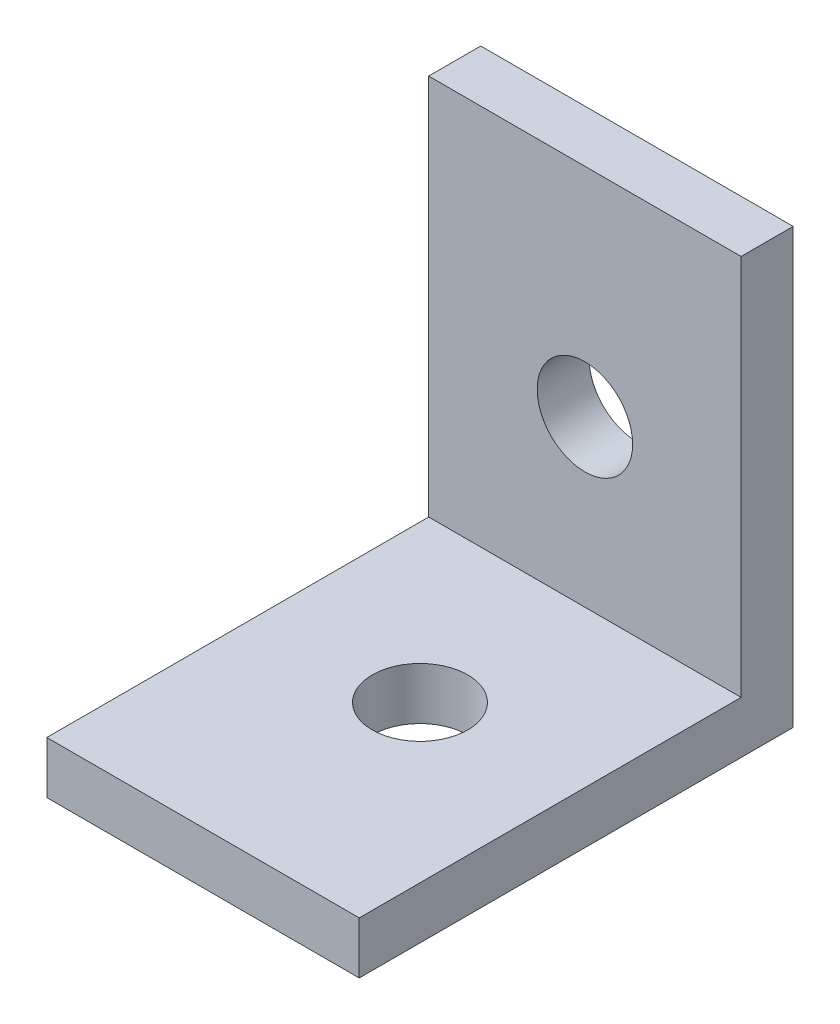
ISO-10303-21;
HEADER;
FILE_DESCRIPTION(('STEP AP214'),'2;1');
FILE_NAME('part.step','',(''),(''),'','','');
FILE_SCHEMA(('AUTOMOTIVE_DESIGN { 1 0 10303 214 1 1 1 1 }'));
ENDSEC;
DATA;
#1=APPLICATION_CONTEXT('core data for automotive mechanical design processes');
#2=APPLICATION_PROTOCOL_DEFINITION('international standard','automotive_design',2000,#1);
#3=PRODUCT_CONTEXT('',#1,'mechanical');
#4=PRODUCT('Part','Part','',(#3));
#5=PRODUCT_RELATED_PRODUCT_CATEGORY('part','',(#4));
#6=PRODUCT_DEFINITION_FORMATION('','',#4);
#7=PRODUCT_DEFINITION_CONTEXT('part definition',#1,'design');
#8=PRODUCT_DEFINITION('design','',#6,#7);
#9=PRODUCT_DEFINITION_SHAPE('','',#8);
#10=(LENGTH_UNIT() NAMED_UNIT(*) SI_UNIT(.MILLI.,.METRE.));
#11=(NAMED_UNIT(*) PLANE_ANGLE_UNIT() SI_UNIT($,.RADIAN.));
#12=(NAMED_UNIT(*) SI_UNIT($,.STERADIAN.) SOLID_ANGLE_UNIT());
#13=UNCERTAINTY_MEASURE_WITH_UNIT(LENGTH_MEASURE(1.E-05),#10,'distance_accuracy_value','');
#14=(GEOMETRIC_REPRESENTATION_CONTEXT(3) GLOBAL_UNCERTAINTY_ASSIGNED_CONTEXT((#13)) GLOBAL_UNIT_ASSIGNED_CONTEXT((#10,
#11,#12)) REPRESENTATION_CONTEXT('',''));
#15=CARTESIAN_POINT('',(0.,0.,0.));
#16=DIRECTION('',(0.,0.,1.));
#17=DIRECTION('',(1.,0.,0.));
#18=AXIS2_PLACEMENT_3D('',#15,#16,#17);
#19=CARTESIAN_POINT('',(0.,3.,0.));
#20=DIRECTION('',(0.,1.,0.));
#21=DIRECTION('',(0.,0.,1.));
#22=AXIS2_PLACEMENT_3D('',#19,#20,#21);
#23=PLANE('',#22);
#24=DIRECTION('',(1.,0.,0.));
#25=VECTOR('',#24,1.);
#26=CARTESIAN_POINT('',(-9.,3.,-9.5));
#27=LINE('',#26,#25);
#28=CARTESIAN_POINT('',(-9.,3.,-9.5));
#29=VERTEX_POINT('',#28);
#30=CARTESIAN_POINT('',(9.,3.,-9.5));
#31=VERTEX_POINT('',#30);
#32=EDGE_CURVE('E53',#29,#31,#27,.T.);
#33=ORIENTED_EDGE('',*,*,#32,.F.);
#34=DIRECTION('',(0.,0.,1.));
#35=VECTOR('',#34,1.);
#36=CARTESIAN_POINT('',(-9.,3.,-12.5));
#37=LINE('',#36,#35);
#38=CARTESIAN_POINT('',(-9.,3.,12.5));
#39=VERTEX_POINT('',#38);
#40=EDGE_CURVE('E150',#29,#39,#37,.T.);
#41=ORIENTED_EDGE('',*,*,#40,.T.);
#42=DIRECTION('',(1.,0.,0.));
#43=VECTOR('',#42,1.);
#44=CARTESIAN_POINT('',(-9.,3.,12.5));
#45=LINE('',#44,#43);
#46=CARTESIAN_POINT('',(9.,3.,12.5));
#47=VERTEX_POINT('',#46);
#48=EDGE_CURVE('E58',#39,#47,#45,.T.);
#49=ORIENTED_EDGE('',*,*,#48,.T.);
#50=DIRECTION('',(0.,0.,-1.));
#51=VECTOR('',#50,1.);
#52=CARTESIAN_POINT('',(9.,3.,-12.5));
#53=LINE('',#52,#51);
#54=EDGE_CURVE('E90',#47,#31,#53,.T.);
#55=ORIENTED_EDGE('',*,*,#54,.T.);
#56=EDGE_LOOP('',(#33,#41,#49,#55));
#57=FACE_BOUND('',#56,.T.);
#58=CARTESIAN_POINT('',(0.,3.,0.));
#59=DIRECTION('',(0.,1.,0.));
#60=DIRECTION('',(0.,0.,1.));
#61=AXIS2_PLACEMENT_3D('',#58,#59,#60);
#62=CIRCLE('',#61,2.75);
#63=CARTESIAN_POINT('',(0.,3.,2.75));
#64=VERTEX_POINT('',#63);
#65=EDGE_CURVE('E101',#64,#64,#62,.T.);
#66=ORIENTED_EDGE('',*,*,#65,.F.);
#67=EDGE_LOOP('',(#66));
#68=FACE_BOUND('',#67,.T.);
#69=ADVANCED_FACE('F39',(#57,#68),#23,.T.);
#70=CARTESIAN_POINT('',(0.,0.,0.));
#71=DIRECTION('',(0.,1.,0.));
#72=DIRECTION('',(0.,0.,1.));
#73=AXIS2_PLACEMENT_3D('',#70,#71,#72);
#74=PLANE('',#73);
#75=DIRECTION('',(0.,0.,-1.));
#76=VECTOR('',#75,1.);
#77=CARTESIAN_POINT('',(9.,0.,-12.5));
#78=LINE('',#77,#76);
#79=CARTESIAN_POINT('',(9.,0.,12.5));
#80=VERTEX_POINT('',#79);
#81=CARTESIAN_POINT('',(9.,0.,-12.5));
#82=VERTEX_POINT('',#81);
#83=EDGE_CURVE('E92',#80,#82,#78,.T.);
#84=ORIENTED_EDGE('',*,*,#83,.F.);
#85=DIRECTION('',(1.,0.,0.));
#86=VECTOR('',#85,1.);
#87=CARTESIAN_POINT('',(-9.,0.,12.5));
#88=LINE('',#87,#86);
#89=CARTESIAN_POINT('',(-9.,0.,12.5));
#90=VERTEX_POINT('',#89);
#91=EDGE_CURVE('E80',#90,#80,#88,.T.);
#92=ORIENTED_EDGE('',*,*,#91,.F.);
#93=DIRECTION('',(0.,0.,1.));
#94=VECTOR('',#93,1.);
#95=CARTESIAN_POINT('',(-9.,0.,-12.5));
#96=LINE('',#95,#94);
#97=CARTESIAN_POINT('',(-9.,0.,-12.5));
#98=VERTEX_POINT('',#97);
#99=EDGE_CURVE('E89',#98,#90,#96,.T.);
#100=ORIENTED_EDGE('',*,*,#99,.F.);
#101=DIRECTION('',(-1.,0.,0.));
#102=VECTOR('',#101,1.);
#103=CARTESIAN_POINT('',(-9.,0.,-12.5));
#104=LINE('',#103,#102);
#105=EDGE_CURVE('E99',#82,#98,#104,.T.);
#106=ORIENTED_EDGE('',*,*,#105,.F.);
#107=EDGE_LOOP('',(#84,#92,#100,#106));
#108=FACE_BOUND('',#107,.T.);
#109=CARTESIAN_POINT('',(0.,0.,0.));
#110=DIRECTION('',(0.,1.,0.));
#111=DIRECTION('',(0.,0.,1.));
#112=AXIS2_PLACEMENT_3D('',#109,#110,#111);
#113=CIRCLE('',#112,2.75);
#114=CARTESIAN_POINT('',(0.,0.,2.75));
#115=VERTEX_POINT('',#114);
#116=EDGE_CURVE('E104',#115,#115,#113,.T.);
#117=ORIENTED_EDGE('',*,*,#116,.T.);
#118=EDGE_LOOP('',(#117));
#119=FACE_BOUND('',#118,.T.);
#120=ADVANCED_FACE('F98',(#108,#119),#74,.F.);
#121=CARTESIAN_POINT('',(9.,3.,-12.5));
#122=DIRECTION('',(-1.,0.,0.));
#123=DIRECTION('',(0.,0.,1.));
#124=AXIS2_PLACEMENT_3D('',#121,#122,#123);
#125=PLANE('',#124);
#126=ORIENTED_EDGE('',*,*,#83,.T.);
#127=DIRECTION('',(0.,-1.,0.));
#128=VECTOR('',#127,1.);
#129=CARTESIAN_POINT('',(9.,3.,-12.5));
#130=LINE('',#129,#128);
#131=CARTESIAN_POINT('',(9.,25.,-12.5));
#132=VERTEX_POINT('',#131);
#133=EDGE_CURVE('E11',#132,#82,#130,.T.);
#134=ORIENTED_EDGE('',*,*,#133,.F.);
#135=DIRECTION('',(0.,0.,-1.));
#136=VECTOR('',#135,1.);
#137=CARTESIAN_POINT('',(9.,25.,-12.5));
#138=LINE('',#137,#136);
#139=CARTESIAN_POINT('',(9.,25.,-9.5));
#140=VERTEX_POINT('',#139);
#141=EDGE_CURVE('E134',#140,#132,#138,.T.);
#142=ORIENTED_EDGE('',*,*,#141,.F.);
#143=DIRECTION('',(0.,-1.,0.));
#144=VECTOR('',#143,1.);
#145=CARTESIAN_POINT('',(9.,25.,-9.5));
#146=LINE('',#145,#144);
#147=EDGE_CURVE('E132',#140,#31,#146,.T.);
#148=ORIENTED_EDGE('',*,*,#147,.T.);
#149=ORIENTED_EDGE('',*,*,#54,.F.);
#150=DIRECTION('',(0.,-1.,0.));
#151=VECTOR('',#150,1.);
#152=CARTESIAN_POINT('',(9.,3.,12.5));
#153=LINE('',#152,#151);
#154=EDGE_CURVE('E82',#47,#80,#153,.T.);
#155=ORIENTED_EDGE('',*,*,#154,.T.);
#156=EDGE_LOOP('',(#126,#134,#142,#148,#149,#155));
#157=FACE_BOUND('',#156,.T.);
#158=ADVANCED_FACE('F41',(#157),#125,.F.);
#159=CARTESIAN_POINT('',(-9.,3.,-12.5));
#160=DIRECTION('',(0.,0.,1.));
#161=DIRECTION('',(1.,0.,0.));
#162=AXIS2_PLACEMENT_3D('',#159,#160,#161);
#163=PLANE('',#162);
#164=CARTESIAN_POINT('',(0.,12.5,-12.5));
#165=DIRECTION('',(0.,0.,1.));
#166=DIRECTION('',(1.,0.,0.));
#167=AXIS2_PLACEMENT_3D('',#164,#165,#166);
#168=CIRCLE('',#167,2.75);
#169=CARTESIAN_POINT('',(2.75,12.5,-12.5));
#170=VERTEX_POINT('',#169);
#171=EDGE_CURVE('E143',#170,#170,#168,.T.);
#172=ORIENTED_EDGE('',*,*,#171,.T.);
#173=EDGE_LOOP('',(#172));
#174=FACE_BOUND('',#173,.T.);
#175=ORIENTED_EDGE('',*,*,#105,.T.);
#176=DIRECTION('',(0.,-1.,0.));
#177=VECTOR('',#176,1.);
#178=CARTESIAN_POINT('',(-9.,3.,-12.5));
#179=LINE('',#178,#177);
#180=CARTESIAN_POINT('',(-9.,25.,-12.5));
#181=VERTEX_POINT('',#180);
#182=EDGE_CURVE('E50',#181,#98,#179,.T.);
#183=ORIENTED_EDGE('',*,*,#182,.F.);
#184=DIRECTION('',(-1.,0.,0.));
#185=VECTOR('',#184,1.);
#186=CARTESIAN_POINT('',(-9.,25.,-12.5));
#187=LINE('',#186,#185);
#188=EDGE_CURVE('E123',#132,#181,#187,.T.);
#189=ORIENTED_EDGE('',*,*,#188,.F.);
#190=ORIENTED_EDGE('',*,*,#133,.T.);
#191=EDGE_LOOP('',(#175,#183,#189,#190));
#192=FACE_BOUND('',#191,.T.);
#193=ADVANCED_FACE('F122',(#174,#192),#163,.F.);
#194=CARTESIAN_POINT('',(-9.,3.,-12.5));
#195=DIRECTION('',(1.,0.,0.));
#196=DIRECTION('',(0.,0.,-1.));
#197=AXIS2_PLACEMENT_3D('',#194,#195,#196);
#198=PLANE('',#197);
#199=ORIENTED_EDGE('',*,*,#99,.T.);
#200=DIRECTION('',(0.,-1.,0.));
#201=VECTOR('',#200,1.);
#202=CARTESIAN_POINT('',(-9.,3.,12.5));
#203=LINE('',#202,#201);
#204=EDGE_CURVE('E85',#39,#90,#203,.T.);
#205=ORIENTED_EDGE('',*,*,#204,.F.);
#206=ORIENTED_EDGE('',*,*,#40,.F.);
#207=DIRECTION('',(0.,-1.,0.));
#208=VECTOR('',#207,1.);
#209=CARTESIAN_POINT('',(-9.,25.,-9.5));
#210=LINE('',#209,#208);
#211=CARTESIAN_POINT('',(-9.,25.,-9.5));
#212=VERTEX_POINT('',#211);
#213=EDGE_CURVE('E131',#212,#29,#210,.T.);
#214=ORIENTED_EDGE('',*,*,#213,.F.);
#215=DIRECTION('',(0.,0.,1.));
#216=VECTOR('',#215,1.);
#217=CARTESIAN_POINT('',(-9.,25.,-12.5));
#218=LINE('',#217,#216);
#219=EDGE_CURVE('E117',#181,#212,#218,.T.);
#220=ORIENTED_EDGE('',*,*,#219,.F.);
#221=ORIENTED_EDGE('',*,*,#182,.T.);
#222=EDGE_LOOP('',(#199,#205,#206,#214,#220,#221));
#223=FACE_BOUND('',#222,.T.);
#224=ADVANCED_FACE('F113',(#223),#198,.F.);
#225=CARTESIAN_POINT('',(-9.,3.,12.5));
#226=DIRECTION('',(0.,0.,-1.));
#227=DIRECTION('',(-1.,0.,0.));
#228=AXIS2_PLACEMENT_3D('',#225,#226,#227);
#229=PLANE('',#228);
#230=ORIENTED_EDGE('',*,*,#91,.T.);
#231=ORIENTED_EDGE('',*,*,#154,.F.);
#232=ORIENTED_EDGE('',*,*,#48,.F.);
#233=ORIENTED_EDGE('',*,*,#204,.T.);
#234=EDGE_LOOP('',(#230,#231,#232,#233));
#235=FACE_BOUND('',#234,.T.);
#236=ADVANCED_FACE('F81',(#235),#229,.F.);
#237=CARTESIAN_POINT('',(0.,3.,0.));
#238=DIRECTION('',(0.,-1.,0.));
#239=DIRECTION('',(0.,0.,-1.));
#240=AXIS2_PLACEMENT_3D('',#237,#238,#239);
#241=CYLINDRICAL_SURFACE('',#240,2.75);
#242=ORIENTED_EDGE('',*,*,#65,.T.);
#243=EDGE_LOOP('',(#242));
#244=FACE_BOUND('',#243,.T.);
#245=ORIENTED_EDGE('',*,*,#116,.F.);
#246=EDGE_LOOP('',(#245));
#247=FACE_BOUND('',#246,.T.);
#248=ADVANCED_FACE('F169',(#244,#247),#241,.F.);
#249=CARTESIAN_POINT('',(-9.,25.,-9.5));
#250=DIRECTION('',(0.,0.,-1.));
#251=DIRECTION('',(-1.,0.,0.));
#252=AXIS2_PLACEMENT_3D('',#249,#250,#251);
#253=PLANE('',#252);
#254=CARTESIAN_POINT('',(0.,12.5,-9.5));
#255=DIRECTION('',(0.,0.,1.));
#256=DIRECTION('',(1.,0.,0.));
#257=AXIS2_PLACEMENT_3D('',#254,#255,#256);
#258=CIRCLE('',#257,2.75);
#259=CARTESIAN_POINT('',(2.75,12.5,-9.5));
#260=VERTEX_POINT('',#259);
#261=EDGE_CURVE('E159',#260,#260,#258,.T.);
#262=ORIENTED_EDGE('',*,*,#261,.F.);
#263=EDGE_LOOP('',(#262));
#264=FACE_BOUND('',#263,.T.);
#265=ORIENTED_EDGE('',*,*,#32,.T.);
#266=ORIENTED_EDGE('',*,*,#147,.F.);
#267=DIRECTION('',(1.,0.,0.));
#268=VECTOR('',#267,1.);
#269=CARTESIAN_POINT('',(-9.,25.,-9.5));
#270=LINE('',#269,#268);
#271=EDGE_CURVE('E137',#212,#140,#270,.T.);
#272=ORIENTED_EDGE('',*,*,#271,.F.);
#273=ORIENTED_EDGE('',*,*,#213,.T.);
#274=EDGE_LOOP('',(#265,#266,#272,#273));
#275=FACE_BOUND('',#274,.T.);
#276=ADVANCED_FACE('F151',(#264,#275),#253,.F.);
#277=CARTESIAN_POINT('',(0.,25.,0.));
#278=DIRECTION('',(0.,1.,0.));
#279=DIRECTION('',(0.,0.,1.));
#280=AXIS2_PLACEMENT_3D('',#277,#278,#279);
#281=PLANE('',#280);
#282=ORIENTED_EDGE('',*,*,#219,.T.);
#283=ORIENTED_EDGE('',*,*,#271,.T.);
#284=ORIENTED_EDGE('',*,*,#141,.T.);
#285=ORIENTED_EDGE('',*,*,#188,.T.);
#286=EDGE_LOOP('',(#282,#283,#284,#285));
#287=FACE_BOUND('',#286,.T.);
#288=ADVANCED_FACE('F126',(#287),#281,.T.);
#289=CARTESIAN_POINT('',(0.,12.5,-31.5));
#290=DIRECTION('',(0.,0.,1.));
#291=DIRECTION('',(1.,0.,0.));
#292=AXIS2_PLACEMENT_3D('',#289,#290,#291);
#293=CYLINDRICAL_SURFACE('',#292,2.75);
#294=ORIENTED_EDGE('',*,*,#261,.T.);
#295=EDGE_LOOP('',(#294));
#296=FACE_BOUND('',#295,.T.);
#297=ORIENTED_EDGE('',*,*,#171,.F.);
#298=EDGE_LOOP('',(#297));
#299=FACE_BOUND('',#298,.T.);
#300=ADVANCED_FACE('F163',(#296,#299),#293,.F.);
#301=CLOSED_SHELL('',(#69,#120,#158,#193,#224,#236,#248,#276,#288,#300));
#302=MANIFOLD_SOLID_BREP('B2',#301);
#303=ADVANCED_BREP_SHAPE_REPRESENTATION('',(#18,#302),#14);
#304=SHAPE_DEFINITION_REPRESENTATION(#9,#303);
ENDSEC;
END-ISO-10303-21;
